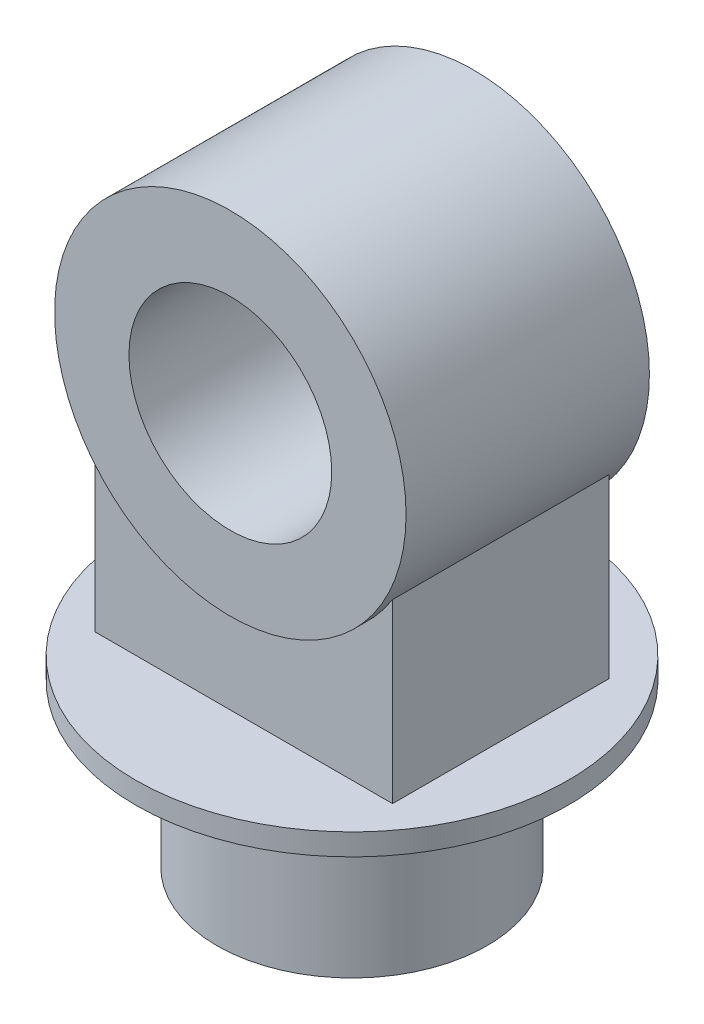
ISO-10303-21;
HEADER;
FILE_DESCRIPTION(('STEP AP214'),'2;1');
FILE_NAME('part.step','',(''),(''),'','','');
FILE_SCHEMA(('AUTOMOTIVE_DESIGN { 1 0 10303 214 1 1 1 1 }'));
ENDSEC;
DATA;
#1=APPLICATION_CONTEXT('core data for automotive mechanical design processes');
#2=APPLICATION_PROTOCOL_DEFINITION('international standard','automotive_design',2000,#1);
#3=PRODUCT_CONTEXT('',#1,'mechanical');
#4=PRODUCT('Part','Part','',(#3));
#5=PRODUCT_RELATED_PRODUCT_CATEGORY('part','',(#4));
#6=PRODUCT_DEFINITION_FORMATION('','',#4);
#7=PRODUCT_DEFINITION_CONTEXT('part definition',#1,'design');
#8=PRODUCT_DEFINITION('design','',#6,#7);
#9=PRODUCT_DEFINITION_SHAPE('','',#8);
#10=(LENGTH_UNIT() NAMED_UNIT(*) SI_UNIT(.MILLI.,.METRE.));
#11=(NAMED_UNIT(*) PLANE_ANGLE_UNIT() SI_UNIT($,.RADIAN.));
#12=(NAMED_UNIT(*) SI_UNIT($,.STERADIAN.) SOLID_ANGLE_UNIT());
#13=UNCERTAINTY_MEASURE_WITH_UNIT(LENGTH_MEASURE(1.E-05),#10,'distance_accuracy_value','');
#14=(GEOMETRIC_REPRESENTATION_CONTEXT(3) GLOBAL_UNCERTAINTY_ASSIGNED_CONTEXT((#13)) GLOBAL_UNIT_ASSIGNED_CONTEXT((#10,
#11,#12)) REPRESENTATION_CONTEXT('',''));
#15=CARTESIAN_POINT('',(0.,0.,0.));
#16=DIRECTION('',(0.,0.,1.));
#17=DIRECTION('',(1.,0.,0.));
#18=AXIS2_PLACEMENT_3D('',#15,#16,#17);
#19=CARTESIAN_POINT('',(0.,120.,0.));
#20=DIRECTION('',(0.,-1.,0.));
#21=DIRECTION('',(0.,0.,-1.));
#22=AXIS2_PLACEMENT_3D('',#19,#20,#21);
#23=CYLINDRICAL_SURFACE('',#22,100.);
#24=CARTESIAN_POINT('',(0.,120.,0.));
#25=DIRECTION('',(0.,1.,0.));
#26=DIRECTION('',(0.,0.,1.));
#27=AXIS2_PLACEMENT_3D('',#24,#25,#26);
#28=CIRCLE('',#27,100.);
#29=CARTESIAN_POINT('',(0.,120.,100.));
#30=VERTEX_POINT('',#29);
#31=EDGE_CURVE('E11',#30,#30,#28,.T.);
#32=ORIENTED_EDGE('',*,*,#31,.F.);
#33=EDGE_LOOP('',(#32));
#34=FACE_BOUND('',#33,.T.);
#35=CARTESIAN_POINT('',(0.,0.,0.));
#36=DIRECTION('',(0.,1.,0.));
#37=DIRECTION('',(0.,0.,1.));
#38=AXIS2_PLACEMENT_3D('',#35,#36,#37);
#39=CIRCLE('',#38,100.);
#40=CARTESIAN_POINT('',(0.,0.,100.));
#41=VERTEX_POINT('',#40);
#42=EDGE_CURVE('E42',#41,#41,#39,.T.);
#43=ORIENTED_EDGE('',*,*,#42,.T.);
#44=EDGE_LOOP('',(#43));
#45=FACE_BOUND('',#44,.T.);
#46=ADVANCED_FACE('F39',(#34,#45),#23,.T.);
#47=CARTESIAN_POINT('',(0.,0.,0.));
#48=DIRECTION('',(0.,1.,0.));
#49=DIRECTION('',(0.,0.,1.));
#50=AXIS2_PLACEMENT_3D('',#47,#48,#49);
#51=PLANE('',#50);
#52=ORIENTED_EDGE('',*,*,#42,.F.);
#53=EDGE_LOOP('',(#52));
#54=FACE_BOUND('',#53,.T.);
#55=ADVANCED_FACE('F123',(#54),#51,.F.);
#56=CARTESIAN_POINT('',(0.,136.,0.));
#57=DIRECTION('',(0.,-1.,0.));
#58=DIRECTION('',(0.,0.,-1.));
#59=AXIS2_PLACEMENT_3D('',#56,#57,#58);
#60=CYLINDRICAL_SURFACE('',#59,160.);
#61=CARTESIAN_POINT('',(0.,136.,0.));
#62=DIRECTION('',(0.,1.,0.));
#63=DIRECTION('',(0.,0.,1.));
#64=AXIS2_PLACEMENT_3D('',#61,#62,#63);
#65=CIRCLE('',#64,160.);
#66=CARTESIAN_POINT('',(0.,136.,160.));
#67=VERTEX_POINT('',#66);
#68=EDGE_CURVE('E107',#67,#67,#65,.T.);
#69=ORIENTED_EDGE('',*,*,#68,.F.);
#70=EDGE_LOOP('',(#69));
#71=FACE_BOUND('',#70,.T.);
#72=CARTESIAN_POINT('',(0.,120.,0.));
#73=DIRECTION('',(0.,1.,0.));
#74=DIRECTION('',(0.,0.,1.));
#75=AXIS2_PLACEMENT_3D('',#72,#73,#74);
#76=CIRCLE('',#75,160.);
#77=CARTESIAN_POINT('',(0.,120.,160.));
#78=VERTEX_POINT('',#77);
#79=EDGE_CURVE('E102',#78,#78,#76,.T.);
#80=ORIENTED_EDGE('',*,*,#79,.T.);
#81=EDGE_LOOP('',(#80));
#82=FACE_BOUND('',#81,.T.);
#83=ADVANCED_FACE('F125',(#71,#82),#60,.T.);
#84=CARTESIAN_POINT('',(0.,136.,0.));
#85=DIRECTION('',(0.,1.,0.));
#86=DIRECTION('',(0.,0.,1.));
#87=AXIS2_PLACEMENT_3D('',#84,#85,#86);
#88=PLANE('',#87);
#89=DIRECTION('',(0.,0.,-1.));
#90=VECTOR('',#89,1.);
#91=CARTESIAN_POINT('',(110.,136.,-80.));
#92=LINE('',#91,#90);
#93=CARTESIAN_POINT('',(110.,136.,80.));
#94=VERTEX_POINT('',#93);
#95=CARTESIAN_POINT('',(110.,136.,-80.));
#96=VERTEX_POINT('',#95);
#97=EDGE_CURVE('E54',#94,#96,#92,.T.);
#98=ORIENTED_EDGE('',*,*,#97,.F.);
#99=DIRECTION('',(1.,0.,0.));
#100=VECTOR('',#99,1.);
#101=CARTESIAN_POINT('',(-110.,136.,80.));
#102=LINE('',#101,#100);
#103=CARTESIAN_POINT('',(-110.,136.,80.));
#104=VERTEX_POINT('',#103);
#105=EDGE_CURVE('E59',#104,#94,#102,.T.);
#106=ORIENTED_EDGE('',*,*,#105,.F.);
#107=DIRECTION('',(0.,0.,1.));
#108=VECTOR('',#107,1.);
#109=CARTESIAN_POINT('',(-110.,136.,-80.));
#110=LINE('',#109,#108);
#111=CARTESIAN_POINT('',(-110.,136.,-80.));
#112=VERTEX_POINT('',#111);
#113=EDGE_CURVE('E192',#112,#104,#110,.T.);
#114=ORIENTED_EDGE('',*,*,#113,.F.);
#115=DIRECTION('',(-1.,0.,0.));
#116=VECTOR('',#115,1.);
#117=CARTESIAN_POINT('',(-110.,136.,-80.));
#118=LINE('',#117,#116);
#119=EDGE_CURVE('E197',#96,#112,#118,.T.);
#120=ORIENTED_EDGE('',*,*,#119,.F.);
#121=EDGE_LOOP('',(#98,#106,#114,#120));
#122=FACE_BOUND('',#121,.T.);
#123=ORIENTED_EDGE('',*,*,#68,.T.);
#124=EDGE_LOOP('',(#123));
#125=FACE_BOUND('',#124,.T.);
#126=ADVANCED_FACE('F130',(#122,#125),#88,.T.);
#127=CARTESIAN_POINT('',(0.,120.,0.));
#128=DIRECTION('',(0.,1.,0.));
#129=DIRECTION('',(0.,0.,1.));
#130=AXIS2_PLACEMENT_3D('',#127,#128,#129);
#131=PLANE('',#130);
#132=ORIENTED_EDGE('',*,*,#31,.T.);
#133=EDGE_LOOP('',(#132));
#134=FACE_BOUND('',#133,.T.);
#135=ORIENTED_EDGE('',*,*,#79,.F.);
#136=EDGE_LOOP('',(#135));
#137=FACE_BOUND('',#136,.T.);
#138=ADVANCED_FACE('F135',(#134,#137),#131,.F.);
#139=CARTESIAN_POINT('',(110.,466.001,-80.));
#140=DIRECTION('',(-1.,0.,0.));
#141=DIRECTION('',(0.,0.,1.));
#142=AXIS2_PLACEMENT_3D('',#139,#140,#141);
#143=PLANE('',#142);
#144=DIRECTION('',(0.,0.,-1.));
#145=VECTOR('',#144,1.);
#146=CARTESIAN_POINT('',(110.,266.717967697245,90.));
#147=LINE('',#146,#145);
#148=CARTESIAN_POINT('',(110.,266.717967697245,80.));
#149=VERTEX_POINT('',#148);
#150=CARTESIAN_POINT('',(110.,266.717967697245,-80.));
#151=VERTEX_POINT('',#150);
#152=EDGE_CURVE('E90',#149,#151,#147,.T.);
#153=ORIENTED_EDGE('',*,*,#152,.F.);
#154=DIRECTION('',(0.,-1.,0.));
#155=VECTOR('',#154,1.);
#156=CARTESIAN_POINT('',(110.,466.001,80.));
#157=LINE('',#156,#155);
#158=EDGE_CURVE('E78',#149,#94,#157,.T.);
#159=ORIENTED_EDGE('',*,*,#158,.T.);
#160=ORIENTED_EDGE('',*,*,#97,.T.);
#161=DIRECTION('',(0.,-1.,0.));
#162=VECTOR('',#161,1.);
#163=CARTESIAN_POINT('',(110.,466.001,-80.));
#164=LINE('',#163,#162);
#165=EDGE_CURVE('E93',#151,#96,#164,.T.);
#166=ORIENTED_EDGE('',*,*,#165,.F.);
#167=EDGE_LOOP('',(#153,#159,#160,#166));
#168=FACE_BOUND('',#167,.T.);
#169=ADVANCED_FACE('F91',(#168),#143,.F.);
#170=CARTESIAN_POINT('',(-110.,466.001,-80.));
#171=DIRECTION('',(0.,0.,1.));
#172=DIRECTION('',(1.,0.,0.));
#173=AXIS2_PLACEMENT_3D('',#170,#171,#172);
#174=PLANE('',#173);
#175=CARTESIAN_POINT('',(0.,336.,-80.));
#176=DIRECTION('',(0.,0.,1.));
#177=DIRECTION('',(1.,0.,0.));
#178=AXIS2_PLACEMENT_3D('',#175,#176,#177);
#179=CIRCLE('',#178,130.);
#180=CARTESIAN_POINT('',(-110.,266.717967697245,-80.0000000000001));
#181=VERTEX_POINT('',#180);
#182=EDGE_CURVE('E97',#151,#181,#179,.F.);
#183=ORIENTED_EDGE('',*,*,#182,.F.);
#184=ORIENTED_EDGE('',*,*,#165,.T.);
#185=ORIENTED_EDGE('',*,*,#119,.T.);
#186=DIRECTION('',(0.,-1.,0.));
#187=VECTOR('',#186,1.);
#188=CARTESIAN_POINT('',(-110.,466.001,-80.));
#189=LINE('',#188,#187);
#190=EDGE_CURVE('E196',#181,#112,#189,.T.);
#191=ORIENTED_EDGE('',*,*,#190,.F.);
#192=EDGE_LOOP('',(#183,#184,#185,#191));
#193=FACE_BOUND('',#192,.T.);
#194=ADVANCED_FACE('F146',(#193),#174,.F.);
#195=CARTESIAN_POINT('',(-110.,466.001,-80.));
#196=DIRECTION('',(1.,0.,0.));
#197=DIRECTION('',(0.,0.,-1.));
#198=AXIS2_PLACEMENT_3D('',#195,#196,#197);
#199=PLANE('',#198);
#200=DIRECTION('',(0.,0.,-1.));
#201=VECTOR('',#200,1.);
#202=CARTESIAN_POINT('',(-110.,266.717967697245,90.));
#203=LINE('',#202,#201);
#204=CARTESIAN_POINT('',(-110.,266.717967697245,80.));
#205=VERTEX_POINT('',#204);
#206=EDGE_CURVE('E100',#181,#205,#203,.F.);
#207=ORIENTED_EDGE('',*,*,#206,.F.);
#208=ORIENTED_EDGE('',*,*,#190,.T.);
#209=ORIENTED_EDGE('',*,*,#113,.T.);
#210=DIRECTION('',(0.,-1.,0.));
#211=VECTOR('',#210,1.);
#212=CARTESIAN_POINT('',(-110.,466.001,80.));
#213=LINE('',#212,#211);
#214=EDGE_CURVE('E191',#205,#104,#213,.T.);
#215=ORIENTED_EDGE('',*,*,#214,.F.);
#216=EDGE_LOOP('',(#207,#208,#209,#215));
#217=FACE_BOUND('',#216,.T.);
#218=ADVANCED_FACE('F143',(#217),#199,.F.);
#219=CARTESIAN_POINT('',(-110.,466.001,80.));
#220=DIRECTION('',(0.,0.,-1.));
#221=DIRECTION('',(-1.,0.,0.));
#222=AXIS2_PLACEMENT_3D('',#219,#220,#221);
#223=PLANE('',#222);
#224=CARTESIAN_POINT('',(0.,336.,80.));
#225=DIRECTION('',(0.,0.,-1.));
#226=DIRECTION('',(-1.,0.,0.));
#227=AXIS2_PLACEMENT_3D('',#224,#225,#226);
#228=CIRCLE('',#227,130.);
#229=EDGE_CURVE('E82',#205,#149,#228,.F.);
#230=ORIENTED_EDGE('',*,*,#229,.F.);
#231=ORIENTED_EDGE('',*,*,#214,.T.);
#232=ORIENTED_EDGE('',*,*,#105,.T.);
#233=ORIENTED_EDGE('',*,*,#158,.F.);
#234=EDGE_LOOP('',(#230,#231,#232,#233));
#235=FACE_BOUND('',#234,.T.);
#236=ADVANCED_FACE('F80',(#235),#223,.F.);
#237=CARTESIAN_POINT('',(0.,336.,90.));
#238=DIRECTION('',(0.,0.,-1.));
#239=DIRECTION('',(-1.,0.,0.));
#240=AXIS2_PLACEMENT_3D('',#237,#238,#239);
#241=CYLINDRICAL_SURFACE('',#240,130.);
#242=CARTESIAN_POINT('',(0.,336.,90.));
#243=DIRECTION('',(0.,0.,1.));
#244=DIRECTION('',(1.,0.,0.));
#245=AXIS2_PLACEMENT_3D('',#242,#243,#244);
#246=CIRCLE('',#245,130.);
#247=CARTESIAN_POINT('',(130.,336.,90.));
#248=VERTEX_POINT('',#247);
#249=EDGE_CURVE('E86',#248,#248,#246,.T.);
#250=ORIENTED_EDGE('',*,*,#249,.F.);
#251=EDGE_LOOP('',(#250));
#252=FACE_BOUND('',#251,.T.);
#253=CARTESIAN_POINT('',(0.,336.,-90.));
#254=DIRECTION('',(0.,0.,1.));
#255=DIRECTION('',(1.,0.,0.));
#256=AXIS2_PLACEMENT_3D('',#253,#254,#255);
#257=CIRCLE('',#256,130.);
#258=CARTESIAN_POINT('',(130.,336.,-90.));
#259=VERTEX_POINT('',#258);
#260=EDGE_CURVE('E180',#259,#259,#257,.T.);
#261=ORIENTED_EDGE('',*,*,#260,.T.);
#262=EDGE_LOOP('',(#261));
#263=FACE_BOUND('',#262,.T.);
#264=ORIENTED_EDGE('',*,*,#229,.T.);
#265=ORIENTED_EDGE('',*,*,#152,.T.);
#266=ORIENTED_EDGE('',*,*,#182,.T.);
#267=ORIENTED_EDGE('',*,*,#206,.T.);
#268=EDGE_LOOP('',(#264,#265,#266,#267));
#269=FACE_BOUND('',#268,.T.);
#270=ADVANCED_FACE('F99',(#252,#263,#269),#241,.T.);
#271=CARTESIAN_POINT('',(0.,336.,90.));
#272=DIRECTION('',(0.,0.,1.));
#273=DIRECTION('',(1.,0.,0.));
#274=AXIS2_PLACEMENT_3D('',#271,#272,#273);
#275=PLANE('',#274);
#276=ORIENTED_EDGE('',*,*,#249,.T.);
#277=EDGE_LOOP('',(#276));
#278=FACE_BOUND('',#277,.T.);
#279=CARTESIAN_POINT('',(0.,336.,90.));
#280=DIRECTION('',(0.,0.,1.));
#281=DIRECTION('',(1.,0.,0.));
#282=AXIS2_PLACEMENT_3D('',#279,#280,#281);
#283=CIRCLE('',#282,75.);
#284=CARTESIAN_POINT('',(-75.,336.,90.));
#285=VERTEX_POINT('',#284);
#286=EDGE_CURVE('E172',#285,#285,#283,.T.);
#287=ORIENTED_EDGE('',*,*,#286,.F.);
#288=EDGE_LOOP('',(#287));
#289=FACE_BOUND('',#288,.T.);
#290=ADVANCED_FACE('F155',(#278,#289),#275,.T.);
#291=CARTESIAN_POINT('',(0.,336.,-90.));
#292=DIRECTION('',(0.,0.,1.));
#293=DIRECTION('',(1.,0.,0.));
#294=AXIS2_PLACEMENT_3D('',#291,#292,#293);
#295=PLANE('',#294);
#296=ORIENTED_EDGE('',*,*,#260,.F.);
#297=EDGE_LOOP('',(#296));
#298=FACE_BOUND('',#297,.T.);
#299=CARTESIAN_POINT('',(0.,336.,-90.));
#300=DIRECTION('',(0.,0.,1.));
#301=DIRECTION('',(1.,0.,0.));
#302=AXIS2_PLACEMENT_3D('',#299,#300,#301);
#303=CIRCLE('',#302,75.);
#304=CARTESIAN_POINT('',(-75.,336.,-90.));
#305=VERTEX_POINT('',#304);
#306=EDGE_CURVE('E175',#305,#305,#303,.T.);
#307=ORIENTED_EDGE('',*,*,#306,.T.);
#308=EDGE_LOOP('',(#307));
#309=FACE_BOUND('',#308,.T.);
#310=ADVANCED_FACE('F157',(#298,#309),#295,.F.);
#311=CARTESIAN_POINT('',(0.,336.,90.));
#312=DIRECTION('',(0.,0.,-1.));
#313=DIRECTION('',(-1.,0.,0.));
#314=AXIS2_PLACEMENT_3D('',#311,#312,#313);
#315=CYLINDRICAL_SURFACE('',#314,75.);
#316=CARTESIAN_POINT('',(-75.,336.,90.));
#317=CARTESIAN_POINT('',(-75.,336.,88.125));
#318=CARTESIAN_POINT('',(-75.,336.,86.25));
#319=CARTESIAN_POINT('',(-75.,336.,82.5));
#320=CARTESIAN_POINT('',(-75.,336.,80.625));
#321=CARTESIAN_POINT('',(-75.,336.,76.875));
#322=CARTESIAN_POINT('',(-75.,336.,75.));
#323=CARTESIAN_POINT('',(-75.,336.,71.25));
#324=CARTESIAN_POINT('',(-75.,336.,69.375));
#325=CARTESIAN_POINT('',(-75.,336.,65.625));
#326=CARTESIAN_POINT('',(-75.,336.,63.75));
#327=CARTESIAN_POINT('',(-75.,336.,60.));
#328=CARTESIAN_POINT('',(-75.,336.,58.125));
#329=CARTESIAN_POINT('',(-75.,336.,54.375));
#330=CARTESIAN_POINT('',(-75.,336.,52.5));
#331=CARTESIAN_POINT('',(-75.,336.,48.75));
#332=CARTESIAN_POINT('',(-75.,336.,46.875));
#333=CARTESIAN_POINT('',(-75.,336.,43.125));
#334=CARTESIAN_POINT('',(-75.,336.,41.25));
#335=CARTESIAN_POINT('',(-75.,336.,37.5));
#336=CARTESIAN_POINT('',(-75.,336.,35.625));
#337=CARTESIAN_POINT('',(-75.,336.,31.875));
#338=CARTESIAN_POINT('',(-75.,336.,30.));
#339=CARTESIAN_POINT('',(-75.,336.,26.25));
#340=CARTESIAN_POINT('',(-75.,336.,24.375));
#341=CARTESIAN_POINT('',(-75.,336.,20.625));
#342=CARTESIAN_POINT('',(-75.,336.,18.75));
#343=CARTESIAN_POINT('',(-75.,336.,15.));
#344=CARTESIAN_POINT('',(-75.,336.,13.125));
#345=CARTESIAN_POINT('',(-75.,336.,9.37499999999998));
#346=CARTESIAN_POINT('',(-75.,336.,7.49999999999998));
#347=CARTESIAN_POINT('',(-75.,336.,3.74999999999998));
#348=CARTESIAN_POINT('',(-75.,336.,1.87499999999997));
#349=CARTESIAN_POINT('',(-75.,336.,-1.87500000000003));
#350=CARTESIAN_POINT('',(-75.,336.,-3.75000000000003));
#351=CARTESIAN_POINT('',(-75.,336.,-7.50000000000003));
#352=CARTESIAN_POINT('',(-75.,336.,-9.37500000000004));
#353=CARTESIAN_POINT('',(-75.,336.,-13.125));
#354=CARTESIAN_POINT('',(-75.,336.,-15.));
#355=CARTESIAN_POINT('',(-75.,336.,-18.75));
#356=CARTESIAN_POINT('',(-75.,336.,-20.625));
#357=CARTESIAN_POINT('',(-75.,336.,-24.375));
#358=CARTESIAN_POINT('',(-75.,336.,-26.25));
#359=CARTESIAN_POINT('',(-75.,336.,-30.));
#360=CARTESIAN_POINT('',(-75.,336.,-31.875));
#361=CARTESIAN_POINT('',(-75.,336.,-35.625));
#362=CARTESIAN_POINT('',(-75.,336.,-37.5));
#363=CARTESIAN_POINT('',(-75.,336.,-41.25));
#364=CARTESIAN_POINT('',(-75.,336.,-43.125));
#365=CARTESIAN_POINT('',(-75.,336.,-46.875));
#366=CARTESIAN_POINT('',(-75.,336.,-48.75));
#367=CARTESIAN_POINT('',(-75.,336.,-52.5));
#368=CARTESIAN_POINT('',(-75.,336.,-54.375));
#369=CARTESIAN_POINT('',(-75.,336.,-58.125));
#370=CARTESIAN_POINT('',(-75.,336.,-60.));
#371=CARTESIAN_POINT('',(-75.,336.,-63.75));
#372=CARTESIAN_POINT('',(-75.,336.,-65.625));
#373=CARTESIAN_POINT('',(-75.,336.,-69.375));
#374=CARTESIAN_POINT('',(-75.,336.,-71.25));
#375=CARTESIAN_POINT('',(-75.,336.,-75.));
#376=CARTESIAN_POINT('',(-75.,336.,-76.875));
#377=CARTESIAN_POINT('',(-75.,336.,-80.625));
#378=CARTESIAN_POINT('',(-75.,336.,-82.5));
#379=CARTESIAN_POINT('',(-75.,336.,-86.25));
#380=CARTESIAN_POINT('',(-75.,336.,-88.125));
#381=CARTESIAN_POINT('',(-75.,336.,-90.));
#382=B_SPLINE_CURVE_WITH_KNOTS('',3,(#316,#317,#318,#319,#320,#321,#322,#323,#324,#325,#326,
#327,#328,#329,#330,#331,#332,#333,#334,#335,#336,#337,#338,#339,#340,#341,#342,#343,#344,#345,
#346,#347,#348,#349,#350,#351,#352,#353,#354,#355,#356,#357,#358,#359,#360,#361,#362,#363,#364,
#365,#366,#367,#368,#369,#370,#371,#372,#373,#374,#375,#376,#377,#378,#379,#380,#381),
.UNSPECIFIED.,.F.,.F.,(4,2,2,2,2,2,2,2,2,2,2,2,2,2,2,2,2,2,2,2,2,2,2,2,2,2,2,2,2,2,2,2,4),(0.,
5.62499999999999,11.25,16.875,22.5,28.125,33.75,39.375,45.,50.625,56.25,61.875,67.5,73.125,
78.75,84.375,90.,95.625,101.25,106.875,112.5,118.125,123.75,129.375,135.,140.625,146.25,151.875,
157.5,163.125,168.75,174.375,180.),.UNSPECIFIED.);
#383=EDGE_CURVE('BSEAM160',#285,#305,#382,.T.);
#384=ORIENTED_EDGE('',*,*,#286,.T.);
#385=ORIENTED_EDGE('',*,*,#306,.F.);
#386=ORIENTED_EDGE('',*,*,#383,.T.);
#387=ORIENTED_EDGE('',*,*,#383,.F.);
#388=EDGE_LOOP('',(#384,#386,#385,#387));
#389=FACE_BOUND('',#388,.T.);
#390=ADVANCED_FACE('F160',(#389),#315,.F.);
#391=CLOSED_SHELL('',(#46,#55,#83,#126,#138,#169,#194,#218,#236,#270,#290,#310,#390));
#392=MANIFOLD_SOLID_BREP('B2',#391);
#393=ADVANCED_BREP_SHAPE_REPRESENTATION('',(#18,#392),#14);
#394=SHAPE_DEFINITION_REPRESENTATION(#9,#393);
ENDSEC;
END-ISO-10303-21;
